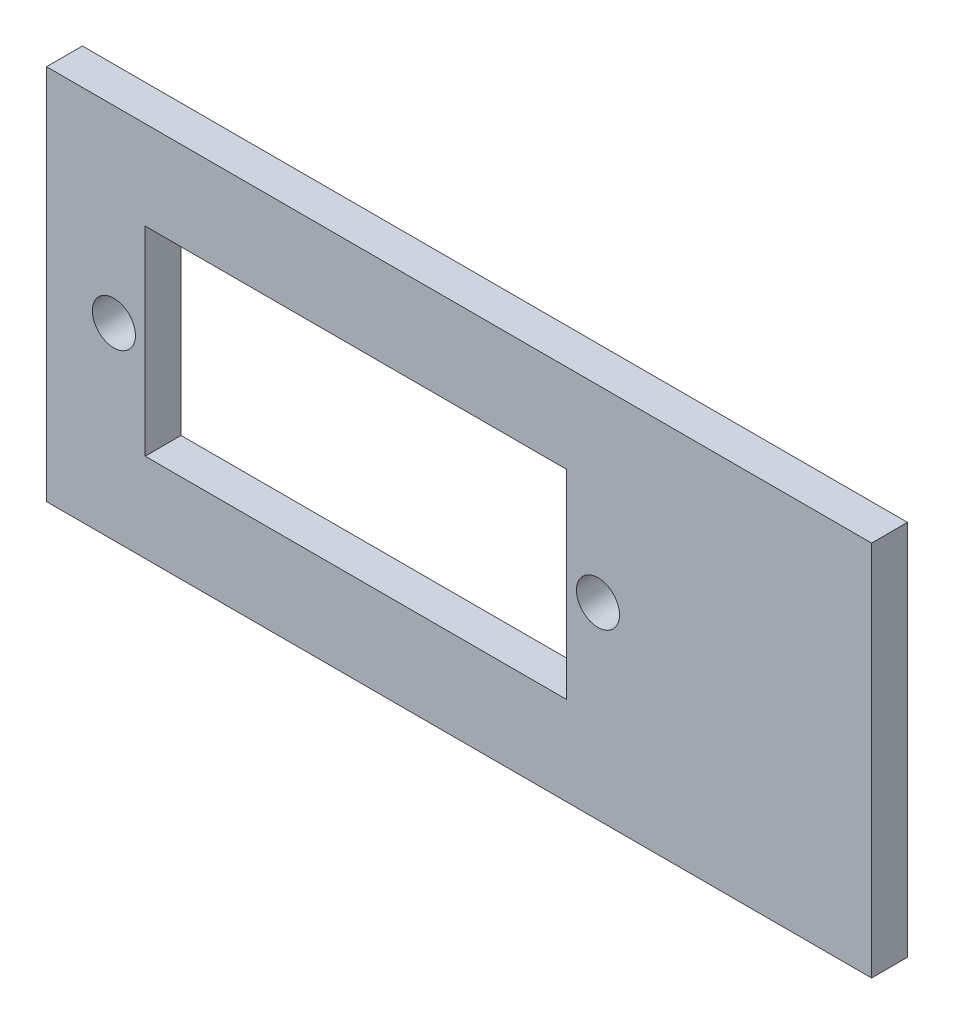
ISO-10303-21;
HEADER;
FILE_DESCRIPTION(('STEP AP214'),'2;1');
FILE_NAME('part.step','',(''),(''),'','','');
FILE_SCHEMA(('AUTOMOTIVE_DESIGN { 1 0 10303 214 1 1 1 1 }'));
ENDSEC;
DATA;
#1=APPLICATION_CONTEXT('core data for automotive mechanical design processes');
#2=APPLICATION_PROTOCOL_DEFINITION('international standard','automotive_design',2000,#1);
#3=PRODUCT_CONTEXT('',#1,'mechanical');
#4=PRODUCT('Part','Part','',(#3));
#5=PRODUCT_RELATED_PRODUCT_CATEGORY('part','',(#4));
#6=PRODUCT_DEFINITION_FORMATION('','',#4);
#7=PRODUCT_DEFINITION_CONTEXT('part definition',#1,'design');
#8=PRODUCT_DEFINITION('design','',#6,#7);
#9=PRODUCT_DEFINITION_SHAPE('','',#8);
#10=(LENGTH_UNIT() NAMED_UNIT(*) SI_UNIT(.MILLI.,.METRE.));
#11=(NAMED_UNIT(*) PLANE_ANGLE_UNIT() SI_UNIT($,.RADIAN.));
#12=(NAMED_UNIT(*) SI_UNIT($,.STERADIAN.) SOLID_ANGLE_UNIT());
#13=UNCERTAINTY_MEASURE_WITH_UNIT(LENGTH_MEASURE(1.E-05),#10,'distance_accuracy_value','');
#14=(GEOMETRIC_REPRESENTATION_CONTEXT(3) GLOBAL_UNCERTAINTY_ASSIGNED_CONTEXT((#13)) GLOBAL_UNIT_ASSIGNED_CONTEXT((#10,
#11,#12)) REPRESENTATION_CONTEXT('',''));
#15=CARTESIAN_POINT('',(0.,0.,0.));
#16=DIRECTION('',(0.,0.,1.));
#17=DIRECTION('',(1.,0.,0.));
#18=AXIS2_PLACEMENT_3D('',#15,#16,#17);
#19=CARTESIAN_POINT('',(-115.,52.5,10.));
#20=DIRECTION('',(1.,0.,0.));
#21=DIRECTION('',(0.,1.,0.));
#22=AXIS2_PLACEMENT_3D('',#19,#20,#21);
#23=PLANE('',#22);
#24=DIRECTION('',(0.,-1.,0.));
#25=VECTOR('',#24,1.);
#26=CARTESIAN_POINT('',(-115.,52.5,0.));
#27=LINE('',#26,#25);
#28=CARTESIAN_POINT('',(-115.,52.5,0.));
#29=VERTEX_POINT('',#28);
#30=CARTESIAN_POINT('',(-115.,-52.5,0.));
#31=VERTEX_POINT('',#30);
#32=EDGE_CURVE('E137',#29,#31,#27,.T.);
#33=ORIENTED_EDGE('',*,*,#32,.T.);
#34=DIRECTION('',(0.,0.,-1.));
#35=VECTOR('',#34,1.);
#36=CARTESIAN_POINT('',(-115.,-52.5,10.));
#37=LINE('',#36,#35);
#38=CARTESIAN_POINT('',(-115.,-52.5,10.));
#39=VERTEX_POINT('',#38);
#40=EDGE_CURVE('E11',#39,#31,#37,.T.);
#41=ORIENTED_EDGE('',*,*,#40,.F.);
#42=DIRECTION('',(0.,-1.,0.));
#43=VECTOR('',#42,1.);
#44=CARTESIAN_POINT('',(-115.,52.5,10.));
#45=LINE('',#44,#43);
#46=CARTESIAN_POINT('',(-115.,52.5,10.));
#47=VERTEX_POINT('',#46);
#48=EDGE_CURVE('E141',#47,#39,#45,.T.);
#49=ORIENTED_EDGE('',*,*,#48,.F.);
#50=DIRECTION('',(0.,0.,-1.));
#51=VECTOR('',#50,1.);
#52=CARTESIAN_POINT('',(-115.,52.5,10.));
#53=LINE('',#52,#51);
#54=EDGE_CURVE('E151',#47,#29,#53,.T.);
#55=ORIENTED_EDGE('',*,*,#54,.T.);
#56=EDGE_LOOP('',(#33,#41,#49,#55));
#57=FACE_BOUND('',#56,.T.);
#58=ADVANCED_FACE('F36',(#57),#23,.F.);
#59=CARTESIAN_POINT('',(115.,-52.5,10.));
#60=DIRECTION('',(0.,1.,0.));
#61=DIRECTION('',(-1.,0.,0.));
#62=AXIS2_PLACEMENT_3D('',#59,#60,#61);
#63=PLANE('',#62);
#64=DIRECTION('',(1.,0.,0.));
#65=VECTOR('',#64,1.);
#66=CARTESIAN_POINT('',(115.,-52.5,0.));
#67=LINE('',#66,#65);
#68=CARTESIAN_POINT('',(115.,-52.5,0.));
#69=VERTEX_POINT('',#68);
#70=EDGE_CURVE('E154',#31,#69,#67,.T.);
#71=ORIENTED_EDGE('',*,*,#70,.T.);
#72=DIRECTION('',(0.,0.,-1.));
#73=VECTOR('',#72,1.);
#74=CARTESIAN_POINT('',(115.,-52.5,10.));
#75=LINE('',#74,#73);
#76=CARTESIAN_POINT('',(115.,-52.5,10.));
#77=VERTEX_POINT('',#76);
#78=EDGE_CURVE('E43',#77,#69,#75,.T.);
#79=ORIENTED_EDGE('',*,*,#78,.F.);
#80=DIRECTION('',(1.,0.,0.));
#81=VECTOR('',#80,1.);
#82=CARTESIAN_POINT('',(115.,-52.5,10.));
#83=LINE('',#82,#81);
#84=EDGE_CURVE('E144',#39,#77,#83,.T.);
#85=ORIENTED_EDGE('',*,*,#84,.F.);
#86=ORIENTED_EDGE('',*,*,#40,.T.);
#87=EDGE_LOOP('',(#71,#79,#85,#86));
#88=FACE_BOUND('',#87,.T.);
#89=ADVANCED_FACE('F182',(#88),#63,.F.);
#90=CARTESIAN_POINT('',(115.,52.5,10.));
#91=DIRECTION('',(-1.,0.,0.));
#92=DIRECTION('',(0.,-1.,0.));
#93=AXIS2_PLACEMENT_3D('',#90,#91,#92);
#94=PLANE('',#93);
#95=DIRECTION('',(0.,1.,0.));
#96=VECTOR('',#95,1.);
#97=CARTESIAN_POINT('',(115.,52.5,0.));
#98=LINE('',#97,#96);
#99=CARTESIAN_POINT('',(115.,52.5,0.));
#100=VERTEX_POINT('',#99);
#101=EDGE_CURVE('E156',#69,#100,#98,.T.);
#102=ORIENTED_EDGE('',*,*,#101,.T.);
#103=DIRECTION('',(0.,0.,-1.));
#104=VECTOR('',#103,1.);
#105=CARTESIAN_POINT('',(115.,52.5,10.));
#106=LINE('',#105,#104);
#107=CARTESIAN_POINT('',(115.,52.5,10.));
#108=VERTEX_POINT('',#107);
#109=EDGE_CURVE('E161',#108,#100,#106,.T.);
#110=ORIENTED_EDGE('',*,*,#109,.F.);
#111=DIRECTION('',(0.,1.,0.));
#112=VECTOR('',#111,1.);
#113=CARTESIAN_POINT('',(115.,52.5,10.));
#114=LINE('',#113,#112);
#115=EDGE_CURVE('E147',#77,#108,#114,.T.);
#116=ORIENTED_EDGE('',*,*,#115,.F.);
#117=ORIENTED_EDGE('',*,*,#78,.T.);
#118=EDGE_LOOP('',(#102,#110,#116,#117));
#119=FACE_BOUND('',#118,.T.);
#120=ADVANCED_FACE('F168',(#119),#94,.F.);
#121=CARTESIAN_POINT('',(115.,52.5,10.));
#122=DIRECTION('',(0.,-1.,0.));
#123=DIRECTION('',(1.,0.,0.));
#124=AXIS2_PLACEMENT_3D('',#121,#122,#123);
#125=PLANE('',#124);
#126=DIRECTION('',(-1.,0.,0.));
#127=VECTOR('',#126,1.);
#128=CARTESIAN_POINT('',(115.,52.5,0.));
#129=LINE('',#128,#127);
#130=EDGE_CURVE('E145',#100,#29,#129,.T.);
#131=ORIENTED_EDGE('',*,*,#130,.T.);
#132=ORIENTED_EDGE('',*,*,#54,.F.);
#133=DIRECTION('',(-1.,0.,0.));
#134=VECTOR('',#133,1.);
#135=CARTESIAN_POINT('',(115.,52.5,10.));
#136=LINE('',#135,#134);
#137=EDGE_CURVE('E149',#108,#47,#136,.T.);
#138=ORIENTED_EDGE('',*,*,#137,.F.);
#139=ORIENTED_EDGE('',*,*,#109,.T.);
#140=EDGE_LOOP('',(#131,#132,#138,#139));
#141=FACE_BOUND('',#140,.T.);
#142=ADVANCED_FACE('F175',(#141),#125,.F.);
#143=CARTESIAN_POINT('',(0.,0.,10.));
#144=DIRECTION('',(0.,0.,-1.));
#145=DIRECTION('',(-1.,0.,0.));
#146=AXIS2_PLACEMENT_3D('',#143,#144,#145);
#147=PLANE('',#146);
#148=CARTESIAN_POINT('',(-96.225,0.,10.));
#149=DIRECTION('',(0.,0.,1.));
#150=DIRECTION('',(1.,0.,0.));
#151=AXIS2_PLACEMENT_3D('',#148,#149,#150);
#152=CIRCLE('',#151,6.);
#153=CARTESIAN_POINT('',(-90.225,0.,10.));
#154=VERTEX_POINT('',#153);
#155=EDGE_CURVE('E124',#154,#154,#152,.T.);
#156=ORIENTED_EDGE('',*,*,#155,.F.);
#157=EDGE_LOOP('',(#156));
#158=FACE_BOUND('',#157,.T.);
#159=CARTESIAN_POINT('',(38.725,0.,10.));
#160=DIRECTION('',(0.,0.,1.));
#161=DIRECTION('',(1.,0.,0.));
#162=AXIS2_PLACEMENT_3D('',#159,#160,#161);
#163=CIRCLE('',#162,6.);
#164=CARTESIAN_POINT('',(44.725,0.,10.));
#165=VERTEX_POINT('',#164);
#166=EDGE_CURVE('E223',#165,#165,#163,.T.);
#167=ORIENTED_EDGE('',*,*,#166,.F.);
#168=EDGE_LOOP('',(#167));
#169=FACE_BOUND('',#168,.T.);
#170=DIRECTION('',(-1.,0.,0.));
#171=VECTOR('',#170,1.);
#172=CARTESIAN_POINT('',(-87.5,27.775,10.));
#173=LINE('',#172,#171);
#174=CARTESIAN_POINT('',(30.,27.775,10.));
#175=VERTEX_POINT('',#174);
#176=CARTESIAN_POINT('',(-87.5,27.775,10.));
#177=VERTEX_POINT('',#176);
#178=EDGE_CURVE('E130',#175,#177,#173,.T.);
#179=ORIENTED_EDGE('',*,*,#178,.F.);
#180=DIRECTION('',(0.,1.,0.));
#181=VECTOR('',#180,1.);
#182=CARTESIAN_POINT('',(30.,27.775,10.));
#183=LINE('',#182,#181);
#184=CARTESIAN_POINT('',(30.,-27.775,10.));
#185=VERTEX_POINT('',#184);
#186=EDGE_CURVE('E50',#185,#175,#183,.T.);
#187=ORIENTED_EDGE('',*,*,#186,.F.);
#188=DIRECTION('',(1.,0.,0.));
#189=VECTOR('',#188,1.);
#190=CARTESIAN_POINT('',(-87.5,-27.775,10.));
#191=LINE('',#190,#189);
#192=CARTESIAN_POINT('',(-87.5,-27.775,10.));
#193=VERTEX_POINT('',#192);
#194=EDGE_CURVE('E118',#193,#185,#191,.T.);
#195=ORIENTED_EDGE('',*,*,#194,.F.);
#196=DIRECTION('',(0.,-1.,0.));
#197=VECTOR('',#196,1.);
#198=CARTESIAN_POINT('',(-87.5,27.775,10.));
#199=LINE('',#198,#197);
#200=EDGE_CURVE('E121',#177,#193,#199,.T.);
#201=ORIENTED_EDGE('',*,*,#200,.F.);
#202=EDGE_LOOP('',(#179,#187,#195,#201));
#203=FACE_BOUND('',#202,.T.);
#204=ORIENTED_EDGE('',*,*,#48,.T.);
#205=ORIENTED_EDGE('',*,*,#84,.T.);
#206=ORIENTED_EDGE('',*,*,#115,.T.);
#207=ORIENTED_EDGE('',*,*,#137,.T.);
#208=EDGE_LOOP('',(#204,#205,#206,#207));
#209=FACE_BOUND('',#208,.T.);
#210=ADVANCED_FACE('F181',(#158,#169,#203,#209),#147,.F.);
#211=CARTESIAN_POINT('',(0.,0.,0.));
#212=DIRECTION('',(0.,0.,-1.));
#213=DIRECTION('',(-1.,0.,0.));
#214=AXIS2_PLACEMENT_3D('',#211,#212,#213);
#215=PLANE('',#214);
#216=CARTESIAN_POINT('',(-96.225,0.,0.));
#217=DIRECTION('',(0.,0.,1.));
#218=DIRECTION('',(1.,0.,0.));
#219=AXIS2_PLACEMENT_3D('',#216,#217,#218);
#220=CIRCLE('',#219,6.);
#221=CARTESIAN_POINT('',(-90.225,0.,0.));
#222=VERTEX_POINT('',#221);
#223=EDGE_CURVE('E225',#222,#222,#220,.T.);
#224=ORIENTED_EDGE('',*,*,#223,.T.);
#225=EDGE_LOOP('',(#224));
#226=FACE_BOUND('',#225,.T.);
#227=CARTESIAN_POINT('',(38.725,0.,0.));
#228=DIRECTION('',(0.,0.,1.));
#229=DIRECTION('',(1.,0.,0.));
#230=AXIS2_PLACEMENT_3D('',#227,#228,#229);
#231=CIRCLE('',#230,6.);
#232=CARTESIAN_POINT('',(44.725,0.,0.));
#233=VERTEX_POINT('',#232);
#234=EDGE_CURVE('E131',#233,#233,#231,.T.);
#235=ORIENTED_EDGE('',*,*,#234,.T.);
#236=EDGE_LOOP('',(#235));
#237=FACE_BOUND('',#236,.T.);
#238=DIRECTION('',(0.,1.,0.));
#239=VECTOR('',#238,1.);
#240=CARTESIAN_POINT('',(30.,27.775,0.));
#241=LINE('',#240,#239);
#242=CARTESIAN_POINT('',(30.,-27.775,0.));
#243=VERTEX_POINT('',#242);
#244=CARTESIAN_POINT('',(30.,27.775,0.));
#245=VERTEX_POINT('',#244);
#246=EDGE_CURVE('E102',#243,#245,#241,.T.);
#247=ORIENTED_EDGE('',*,*,#246,.T.);
#248=DIRECTION('',(-1.,0.,0.));
#249=VECTOR('',#248,1.);
#250=CARTESIAN_POINT('',(-87.5,27.775,0.));
#251=LINE('',#250,#249);
#252=CARTESIAN_POINT('',(-87.5,27.775,0.));
#253=VERTEX_POINT('',#252);
#254=EDGE_CURVE('E111',#245,#253,#251,.T.);
#255=ORIENTED_EDGE('',*,*,#254,.T.);
#256=DIRECTION('',(0.,-1.,0.));
#257=VECTOR('',#256,1.);
#258=CARTESIAN_POINT('',(-87.5,27.775,0.));
#259=LINE('',#258,#257);
#260=CARTESIAN_POINT('',(-87.5,-27.775,0.));
#261=VERTEX_POINT('',#260);
#262=EDGE_CURVE('E58',#253,#261,#259,.T.);
#263=ORIENTED_EDGE('',*,*,#262,.T.);
#264=DIRECTION('',(1.,0.,0.));
#265=VECTOR('',#264,1.);
#266=CARTESIAN_POINT('',(-87.5,-27.775,0.));
#267=LINE('',#266,#265);
#268=EDGE_CURVE('E108',#261,#243,#267,.T.);
#269=ORIENTED_EDGE('',*,*,#268,.T.);
#270=EDGE_LOOP('',(#247,#255,#263,#269));
#271=FACE_BOUND('',#270,.T.);
#272=ORIENTED_EDGE('',*,*,#32,.F.);
#273=ORIENTED_EDGE('',*,*,#130,.F.);
#274=ORIENTED_EDGE('',*,*,#101,.F.);
#275=ORIENTED_EDGE('',*,*,#70,.F.);
#276=EDGE_LOOP('',(#272,#273,#274,#275));
#277=FACE_BOUND('',#276,.T.);
#278=ADVANCED_FACE('F115',(#226,#237,#271,#277),#215,.T.);
#279=CARTESIAN_POINT('',(30.,27.775,0.));
#280=DIRECTION('',(1.,0.,0.));
#281=DIRECTION('',(0.,0.,-1.));
#282=AXIS2_PLACEMENT_3D('',#279,#280,#281);
#283=PLANE('',#282);
#284=ORIENTED_EDGE('',*,*,#186,.T.);
#285=DIRECTION('',(0.,0.,1.));
#286=VECTOR('',#285,1.);
#287=CARTESIAN_POINT('',(30.,27.775,0.));
#288=LINE('',#287,#286);
#289=EDGE_CURVE('E98',#245,#175,#288,.T.);
#290=ORIENTED_EDGE('',*,*,#289,.F.);
#291=ORIENTED_EDGE('',*,*,#246,.F.);
#292=DIRECTION('',(0.,0.,1.));
#293=VECTOR('',#292,1.);
#294=CARTESIAN_POINT('',(30.,-27.775,0.));
#295=LINE('',#294,#293);
#296=EDGE_CURVE('E135',#243,#185,#295,.T.);
#297=ORIENTED_EDGE('',*,*,#296,.T.);
#298=EDGE_LOOP('',(#284,#290,#291,#297));
#299=FACE_BOUND('',#298,.T.);
#300=ADVANCED_FACE('F100',(#299),#283,.F.);
#301=CARTESIAN_POINT('',(-87.5,-27.775,0.));
#302=DIRECTION('',(0.,-1.,0.));
#303=DIRECTION('',(1.,0.,0.));
#304=AXIS2_PLACEMENT_3D('',#301,#302,#303);
#305=PLANE('',#304);
#306=ORIENTED_EDGE('',*,*,#194,.T.);
#307=ORIENTED_EDGE('',*,*,#296,.F.);
#308=ORIENTED_EDGE('',*,*,#268,.F.);
#309=DIRECTION('',(0.,0.,1.));
#310=VECTOR('',#309,1.);
#311=CARTESIAN_POINT('',(-87.5,-27.775,0.));
#312=LINE('',#311,#310);
#313=EDGE_CURVE('E138',#261,#193,#312,.T.);
#314=ORIENTED_EDGE('',*,*,#313,.T.);
#315=EDGE_LOOP('',(#306,#307,#308,#314));
#316=FACE_BOUND('',#315,.T.);
#317=ADVANCED_FACE('F200',(#316),#305,.F.);
#318=CARTESIAN_POINT('',(-87.5,27.775,0.));
#319=DIRECTION('',(-1.,0.,0.));
#320=DIRECTION('',(0.,-1.,0.));
#321=AXIS2_PLACEMENT_3D('',#318,#319,#320);
#322=PLANE('',#321);
#323=ORIENTED_EDGE('',*,*,#200,.T.);
#324=ORIENTED_EDGE('',*,*,#313,.F.);
#325=ORIENTED_EDGE('',*,*,#262,.F.);
#326=DIRECTION('',(0.,0.,1.));
#327=VECTOR('',#326,1.);
#328=CARTESIAN_POINT('',(-87.5,27.775,0.));
#329=LINE('',#328,#327);
#330=EDGE_CURVE('E107',#253,#177,#329,.T.);
#331=ORIENTED_EDGE('',*,*,#330,.T.);
#332=EDGE_LOOP('',(#323,#324,#325,#331));
#333=FACE_BOUND('',#332,.T.);
#334=ADVANCED_FACE('F204',(#333),#322,.F.);
#335=CARTESIAN_POINT('',(-87.5,27.775,0.));
#336=DIRECTION('',(0.,1.,0.));
#337=DIRECTION('',(-1.,0.,0.));
#338=AXIS2_PLACEMENT_3D('',#335,#336,#337);
#339=PLANE('',#338);
#340=ORIENTED_EDGE('',*,*,#178,.T.);
#341=ORIENTED_EDGE('',*,*,#330,.F.);
#342=ORIENTED_EDGE('',*,*,#254,.F.);
#343=ORIENTED_EDGE('',*,*,#289,.T.);
#344=EDGE_LOOP('',(#340,#341,#342,#343));
#345=FACE_BOUND('',#344,.T.);
#346=ADVANCED_FACE('F112',(#345),#339,.F.);
#347=CARTESIAN_POINT('',(38.725,0.,0.));
#348=DIRECTION('',(0.,0.,1.));
#349=DIRECTION('',(1.,0.,0.));
#350=AXIS2_PLACEMENT_3D('',#347,#348,#349);
#351=CYLINDRICAL_SURFACE('',#350,6.);
#352=ORIENTED_EDGE('',*,*,#234,.F.);
#353=EDGE_LOOP('',(#352));
#354=FACE_BOUND('',#353,.T.);
#355=ORIENTED_EDGE('',*,*,#166,.T.);
#356=EDGE_LOOP('',(#355));
#357=FACE_BOUND('',#356,.T.);
#358=ADVANCED_FACE('F203',(#354,#357),#351,.F.);
#359=CARTESIAN_POINT('',(-96.225,0.,0.));
#360=DIRECTION('',(0.,0.,1.));
#361=DIRECTION('',(1.,0.,0.));
#362=AXIS2_PLACEMENT_3D('',#359,#360,#361);
#363=CYLINDRICAL_SURFACE('',#362,6.);
#364=ORIENTED_EDGE('',*,*,#223,.F.);
#365=EDGE_LOOP('',(#364));
#366=FACE_BOUND('',#365,.T.);
#367=ORIENTED_EDGE('',*,*,#155,.T.);
#368=EDGE_LOOP('',(#367));
#369=FACE_BOUND('',#368,.T.);
#370=ADVANCED_FACE('F210',(#366,#369),#363,.F.);
#371=CLOSED_SHELL('',(#58,#89,#120,#142,#210,#278,#300,#317,#334,#346,#358,#370));
#372=MANIFOLD_SOLID_BREP('B2',#371);
#373=ADVANCED_BREP_SHAPE_REPRESENTATION('',(#18,#372),#14);
#374=SHAPE_DEFINITION_REPRESENTATION(#9,#373);
ENDSEC;
END-ISO-10303-21;
